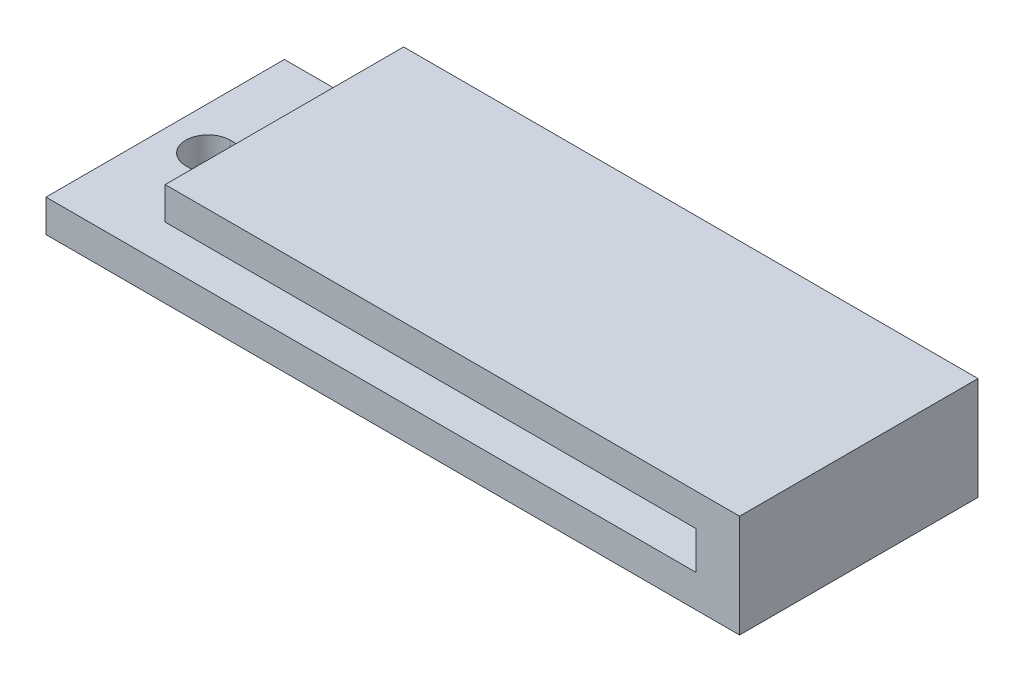
ISO-10303-21;
HEADER;
FILE_DESCRIPTION(('STEP AP214'),'2;1');
FILE_NAME('part.step','',(''),(''),'','','');
FILE_SCHEMA(('AUTOMOTIVE_DESIGN { 1 0 10303 214 1 1 1 1 }'));
ENDSEC;
DATA;
#1=APPLICATION_CONTEXT('core data for automotive mechanical design processes');
#2=APPLICATION_PROTOCOL_DEFINITION('international standard','automotive_design',2000,#1);
#3=PRODUCT_CONTEXT('',#1,'mechanical');
#4=PRODUCT('Part','Part','',(#3));
#5=PRODUCT_RELATED_PRODUCT_CATEGORY('part','',(#4));
#6=PRODUCT_DEFINITION_FORMATION('','',#4);
#7=PRODUCT_DEFINITION_CONTEXT('part definition',#1,'design');
#8=PRODUCT_DEFINITION('design','',#6,#7);
#9=PRODUCT_DEFINITION_SHAPE('','',#8);
#10=(LENGTH_UNIT() NAMED_UNIT(*) SI_UNIT(.MILLI.,.METRE.));
#11=(NAMED_UNIT(*) PLANE_ANGLE_UNIT() SI_UNIT($,.RADIAN.));
#12=(NAMED_UNIT(*) SI_UNIT($,.STERADIAN.) SOLID_ANGLE_UNIT());
#13=UNCERTAINTY_MEASURE_WITH_UNIT(LENGTH_MEASURE(1.E-05),#10,'distance_accuracy_value','');
#14=(GEOMETRIC_REPRESENTATION_CONTEXT(3) GLOBAL_UNCERTAINTY_ASSIGNED_CONTEXT((#13)) GLOBAL_UNIT_ASSIGNED_CONTEXT((#10,
#11,#12)) REPRESENTATION_CONTEXT('',''));
#15=CARTESIAN_POINT('',(0.,0.,0.));
#16=DIRECTION('',(0.,0.,1.));
#17=DIRECTION('',(1.,0.,0.));
#18=AXIS2_PLACEMENT_3D('',#15,#16,#17);
#19=CARTESIAN_POINT('',(-49.,3.,0.));
#20=DIRECTION('',(0.,0.,-1.));
#21=DIRECTION('',(-1.,0.,0.));
#22=AXIS2_PLACEMENT_3D('',#19,#20,#21);
#23=PLANE('',#22);
#24=DIRECTION('',(1.,0.,0.));
#25=VECTOR('',#24,1.);
#26=CARTESIAN_POINT('',(-49.,0.,0.));
#27=LINE('',#26,#25);
#28=CARTESIAN_POINT('',(-49.,0.,0.));
#29=VERTEX_POINT('',#28);
#30=CARTESIAN_POINT('',(0.,0.,0.));
#31=VERTEX_POINT('',#30);
#32=EDGE_CURVE('E236',#29,#31,#27,.T.);
#33=ORIENTED_EDGE('',*,*,#32,.T.);
#34=DIRECTION('',(0.,-1.,0.));
#35=VECTOR('',#34,1.);
#36=CARTESIAN_POINT('',(0.,0.,0.));
#37=LINE('',#36,#35);
#38=CARTESIAN_POINT('',(0.,-3.5,0.));
#39=VERTEX_POINT('',#38);
#40=EDGE_CURVE('E215',#31,#39,#37,.T.);
#41=ORIENTED_EDGE('',*,*,#40,.T.);
#42=DIRECTION('',(-1.,0.,0.));
#43=VECTOR('',#42,1.);
#44=CARTESIAN_POINT('',(0.,-3.5,0.));
#45=LINE('',#44,#43);
#46=CARTESIAN_POINT('',(-60.,-3.5,0.));
#47=VERTEX_POINT('',#46);
#48=EDGE_CURVE('E177',#39,#47,#45,.T.);
#49=ORIENTED_EDGE('',*,*,#48,.T.);
#50=DIRECTION('',(0.,1.,0.));
#51=VECTOR('',#50,1.);
#52=CARTESIAN_POINT('',(-60.,-6.5,0.));
#53=LINE('',#52,#51);
#54=CARTESIAN_POINT('',(-60.,-6.5,0.));
#55=VERTEX_POINT('',#54);
#56=EDGE_CURVE('E211',#55,#47,#53,.T.);
#57=ORIENTED_EDGE('',*,*,#56,.F.);
#58=DIRECTION('',(-1.,0.,0.));
#59=VECTOR('',#58,1.);
#60=CARTESIAN_POINT('',(0.,-6.5,0.));
#61=LINE('',#60,#59);
#62=CARTESIAN_POINT('',(4.,-6.5,0.));
#63=VERTEX_POINT('',#62);
#64=EDGE_CURVE('E183',#63,#55,#61,.T.);
#65=ORIENTED_EDGE('',*,*,#64,.F.);
#66=DIRECTION('',(0.,1.,0.));
#67=VECTOR('',#66,1.);
#68=CARTESIAN_POINT('',(4.,3.,0.));
#69=LINE('',#68,#67);
#70=CARTESIAN_POINT('',(4.,3.,0.));
#71=VERTEX_POINT('',#70);
#72=EDGE_CURVE('E221',#63,#71,#69,.T.);
#73=ORIENTED_EDGE('',*,*,#72,.T.);
#74=DIRECTION('',(1.,0.,0.));
#75=VECTOR('',#74,1.);
#76=CARTESIAN_POINT('',(-49.,3.,0.));
#77=LINE('',#76,#75);
#78=CARTESIAN_POINT('',(-49.,3.,0.));
#79=VERTEX_POINT('',#78);
#80=EDGE_CURVE('E240',#79,#71,#77,.T.);
#81=ORIENTED_EDGE('',*,*,#80,.F.);
#82=DIRECTION('',(0.,-1.,0.));
#83=VECTOR('',#82,1.);
#84=CARTESIAN_POINT('',(-49.,3.,0.));
#85=LINE('',#84,#83);
#86=EDGE_CURVE('E53',#79,#29,#85,.T.);
#87=ORIENTED_EDGE('',*,*,#86,.T.);
#88=EDGE_LOOP('',(#33,#41,#49,#57,#65,#73,#81,#87));
#89=FACE_BOUND('',#88,.T.);
#90=ADVANCED_FACE('F45',(#89),#23,.F.);
#91=CARTESIAN_POINT('',(0.,3.,-22.));
#92=DIRECTION('',(0.,0.,1.));
#93=DIRECTION('',(1.,0.,0.));
#94=AXIS2_PLACEMENT_3D('',#91,#92,#93);
#95=PLANE('',#94);
#96=DIRECTION('',(-1.,0.,0.));
#97=VECTOR('',#96,1.);
#98=CARTESIAN_POINT('',(0.,0.,-22.));
#99=LINE('',#98,#97);
#100=CARTESIAN_POINT('',(0.,0.,-22.));
#101=VERTEX_POINT('',#100);
#102=CARTESIAN_POINT('',(-49.,0.,-22.));
#103=VERTEX_POINT('',#102);
#104=EDGE_CURVE('E257',#101,#103,#99,.T.);
#105=ORIENTED_EDGE('',*,*,#104,.T.);
#106=DIRECTION('',(0.,-1.,0.));
#107=VECTOR('',#106,1.);
#108=CARTESIAN_POINT('',(-49.,3.,-22.));
#109=LINE('',#108,#107);
#110=CARTESIAN_POINT('',(-49.,3.,-22.));
#111=VERTEX_POINT('',#110);
#112=EDGE_CURVE('E11',#111,#103,#109,.T.);
#113=ORIENTED_EDGE('',*,*,#112,.F.);
#114=DIRECTION('',(-1.,0.,0.));
#115=VECTOR('',#114,1.);
#116=CARTESIAN_POINT('',(0.,3.,-22.));
#117=LINE('',#116,#115);
#118=CARTESIAN_POINT('',(4.,3.,-22.));
#119=VERTEX_POINT('',#118);
#120=EDGE_CURVE('E243',#119,#111,#117,.T.);
#121=ORIENTED_EDGE('',*,*,#120,.F.);
#122=DIRECTION('',(0.,1.,0.));
#123=VECTOR('',#122,1.);
#124=CARTESIAN_POINT('',(4.,3.,-22.));
#125=LINE('',#124,#123);
#126=CARTESIAN_POINT('',(4.,-6.5,-22.));
#127=VERTEX_POINT('',#126);
#128=EDGE_CURVE('E220',#127,#119,#125,.T.);
#129=ORIENTED_EDGE('',*,*,#128,.F.);
#130=DIRECTION('',(1.,0.,0.));
#131=VECTOR('',#130,1.);
#132=CARTESIAN_POINT('',(0.,-6.5,-22.));
#133=LINE('',#132,#131);
#134=CARTESIAN_POINT('',(-60.,-6.5,-22.));
#135=VERTEX_POINT('',#134);
#136=EDGE_CURVE('E190',#135,#127,#133,.T.);
#137=ORIENTED_EDGE('',*,*,#136,.F.);
#138=DIRECTION('',(0.,1.,0.));
#139=VECTOR('',#138,1.);
#140=CARTESIAN_POINT('',(-60.,-6.5,-22.));
#141=LINE('',#140,#139);
#142=CARTESIAN_POINT('',(-60.,-3.5,-22.));
#143=VERTEX_POINT('',#142);
#144=EDGE_CURVE('E198',#135,#143,#141,.T.);
#145=ORIENTED_EDGE('',*,*,#144,.T.);
#146=DIRECTION('',(1.,0.,0.));
#147=VECTOR('',#146,1.);
#148=CARTESIAN_POINT('',(4.,-3.5,-22.));
#149=LINE('',#148,#147);
#150=CARTESIAN_POINT('',(0.,-3.5,-22.));
#151=VERTEX_POINT('',#150);
#152=EDGE_CURVE('E187',#143,#151,#149,.T.);
#153=ORIENTED_EDGE('',*,*,#152,.T.);
#154=DIRECTION('',(0.,-1.,0.));
#155=VECTOR('',#154,1.);
#156=CARTESIAN_POINT('',(0.,0.,-22.));
#157=LINE('',#156,#155);
#158=EDGE_CURVE('E216',#101,#151,#157,.T.);
#159=ORIENTED_EDGE('',*,*,#158,.F.);
#160=EDGE_LOOP('',(#105,#113,#121,#129,#137,#145,#153,#159));
#161=FACE_BOUND('',#160,.T.);
#162=ADVANCED_FACE('F277',(#161),#95,.F.);
#163=CARTESIAN_POINT('',(-49.,3.,-22.));
#164=DIRECTION('',(1.,0.,0.));
#165=DIRECTION('',(0.,0.,-1.));
#166=AXIS2_PLACEMENT_3D('',#163,#164,#165);
#167=PLANE('',#166);
#168=DIRECTION('',(0.,0.,1.));
#169=VECTOR('',#168,1.);
#170=CARTESIAN_POINT('',(-49.,0.,-22.));
#171=LINE('',#170,#169);
#172=EDGE_CURVE('E244',#103,#29,#171,.T.);
#173=ORIENTED_EDGE('',*,*,#172,.T.);
#174=ORIENTED_EDGE('',*,*,#86,.F.);
#175=DIRECTION('',(0.,0.,1.));
#176=VECTOR('',#175,1.);
#177=CARTESIAN_POINT('',(-49.,3.,-22.));
#178=LINE('',#177,#176);
#179=EDGE_CURVE('E247',#111,#79,#178,.T.);
#180=ORIENTED_EDGE('',*,*,#179,.F.);
#181=ORIENTED_EDGE('',*,*,#112,.T.);
#182=EDGE_LOOP('',(#173,#174,#180,#181));
#183=FACE_BOUND('',#182,.T.);
#184=ADVANCED_FACE('F295',(#183),#167,.F.);
#185=CARTESIAN_POINT('',(0.,3.,0.));
#186=DIRECTION('',(0.,1.,0.));
#187=DIRECTION('',(0.,0.,1.));
#188=AXIS2_PLACEMENT_3D('',#185,#186,#187);
#189=PLANE('',#188);
#190=ORIENTED_EDGE('',*,*,#80,.T.);
#191=DIRECTION('',(0.,0.,1.));
#192=VECTOR('',#191,1.);
#193=CARTESIAN_POINT('',(4.,3.,-22.));
#194=LINE('',#193,#192);
#195=EDGE_CURVE('E232',#119,#71,#194,.T.);
#196=ORIENTED_EDGE('',*,*,#195,.F.);
#197=ORIENTED_EDGE('',*,*,#120,.T.);
#198=ORIENTED_EDGE('',*,*,#179,.T.);
#199=EDGE_LOOP('',(#190,#196,#197,#198));
#200=FACE_BOUND('',#199,.T.);
#201=ADVANCED_FACE('F294',(#200),#189,.T.);
#202=CARTESIAN_POINT('',(0.,0.,0.));
#203=DIRECTION('',(0.,1.,0.));
#204=DIRECTION('',(0.,0.,1.));
#205=AXIS2_PLACEMENT_3D('',#202,#203,#204);
#206=PLANE('',#205);
#207=ORIENTED_EDGE('',*,*,#32,.F.);
#208=ORIENTED_EDGE('',*,*,#172,.F.);
#209=ORIENTED_EDGE('',*,*,#104,.F.);
#210=DIRECTION('',(0.,0.,-1.));
#211=VECTOR('',#210,1.);
#212=CARTESIAN_POINT('',(0.,0.,0.));
#213=LINE('',#212,#211);
#214=EDGE_CURVE('E253',#31,#101,#213,.T.);
#215=ORIENTED_EDGE('',*,*,#214,.F.);
#216=EDGE_LOOP('',(#207,#208,#209,#215));
#217=FACE_BOUND('',#216,.T.);
#218=ADVANCED_FACE('F272',(#217),#206,.F.);
#219=CARTESIAN_POINT('',(4.,3.,-22.));
#220=DIRECTION('',(1.,0.,0.));
#221=DIRECTION('',(0.,1.,0.));
#222=AXIS2_PLACEMENT_3D('',#219,#220,#221);
#223=PLANE('',#222);
#224=ORIENTED_EDGE('',*,*,#72,.F.);
#225=DIRECTION('',(0.,0.,1.));
#226=VECTOR('',#225,1.);
#227=CARTESIAN_POINT('',(4.,-6.5,0.));
#228=LINE('',#227,#226);
#229=EDGE_CURVE('E194',#127,#63,#228,.T.);
#230=ORIENTED_EDGE('',*,*,#229,.F.);
#231=ORIENTED_EDGE('',*,*,#128,.T.);
#232=ORIENTED_EDGE('',*,*,#195,.T.);
#233=EDGE_LOOP('',(#224,#230,#231,#232));
#234=FACE_BOUND('',#233,.T.);
#235=ADVANCED_FACE('F291',(#234),#223,.T.);
#236=CARTESIAN_POINT('',(0.,0.,-22.));
#237=DIRECTION('',(-1.,0.,0.));
#238=DIRECTION('',(0.,-1.,0.));
#239=AXIS2_PLACEMENT_3D('',#236,#237,#238);
#240=PLANE('',#239);
#241=ORIENTED_EDGE('',*,*,#40,.F.);
#242=ORIENTED_EDGE('',*,*,#214,.T.);
#243=ORIENTED_EDGE('',*,*,#158,.T.);
#244=DIRECTION('',(0.,0.,1.));
#245=VECTOR('',#244,1.);
#246=CARTESIAN_POINT('',(0.,-3.5,-22.));
#247=LINE('',#246,#245);
#248=EDGE_CURVE('E225',#151,#39,#247,.T.);
#249=ORIENTED_EDGE('',*,*,#248,.T.);
#250=EDGE_LOOP('',(#241,#242,#243,#249));
#251=FACE_BOUND('',#250,.T.);
#252=ADVANCED_FACE('F275',(#251),#240,.T.);
#253=CARTESIAN_POINT('',(0.,-3.5,0.));
#254=DIRECTION('',(0.,1.,0.));
#255=DIRECTION('',(0.,0.,1.));
#256=AXIS2_PLACEMENT_3D('',#253,#254,#255);
#257=PLANE('',#256);
#258=CARTESIAN_POINT('',(-56.05,-3.5,-11.));
#259=DIRECTION('',(0.,-1.,0.));
#260=DIRECTION('',(0.,0.,-1.));
#261=AXIS2_PLACEMENT_3D('',#258,#259,#260);
#262=CIRCLE('',#261,2.04999999999999);
#263=CARTESIAN_POINT('',(-56.05,-3.5,-8.95000000000001));
#264=VERTEX_POINT('',#263);
#265=CARTESIAN_POINT('',(-56.05,-3.5,-13.05));
#266=VERTEX_POINT('',#265);
#267=EDGE_CURVE('E136',#264,#266,#262,.T.);
#268=ORIENTED_EDGE('',*,*,#267,.T.);
#269=DIRECTION('',(1.,0.,0.));
#270=VECTOR('',#269,1.);
#271=CARTESIAN_POINT('',(-56.05,-3.5,-13.05));
#272=LINE('',#271,#270);
#273=CARTESIAN_POINT('',(-54.,-3.5,-13.05));
#274=VERTEX_POINT('',#273);
#275=EDGE_CURVE('E146',#266,#274,#272,.T.);
#276=ORIENTED_EDGE('',*,*,#275,.T.);
#277=CARTESIAN_POINT('',(-54.,-3.5,-11.));
#278=DIRECTION('',(0.,-1.,0.));
#279=DIRECTION('',(0.,0.,1.));
#280=AXIS2_PLACEMENT_3D('',#277,#278,#279);
#281=CIRCLE('',#280,2.05);
#282=CARTESIAN_POINT('',(-54.,-3.5,-8.95000000000001));
#283=VERTEX_POINT('',#282);
#284=EDGE_CURVE('E60',#274,#283,#281,.T.);
#285=ORIENTED_EDGE('',*,*,#284,.T.);
#286=DIRECTION('',(-1.,0.,0.));
#287=VECTOR('',#286,1.);
#288=CARTESIAN_POINT('',(-56.05,-3.5,-8.95000000000001));
#289=LINE('',#288,#287);
#290=EDGE_CURVE('E143',#283,#264,#289,.T.);
#291=ORIENTED_EDGE('',*,*,#290,.T.);
#292=EDGE_LOOP('',(#268,#276,#285,#291));
#293=FACE_BOUND('',#292,.T.);
#294=ORIENTED_EDGE('',*,*,#248,.F.);
#295=ORIENTED_EDGE('',*,*,#152,.F.);
#296=DIRECTION('',(0.,0.,-1.));
#297=VECTOR('',#296,1.);
#298=CARTESIAN_POINT('',(-60.,-3.5,-22.));
#299=LINE('',#298,#297);
#300=EDGE_CURVE('E201',#47,#143,#299,.T.);
#301=ORIENTED_EDGE('',*,*,#300,.F.);
#302=ORIENTED_EDGE('',*,*,#48,.F.);
#303=EDGE_LOOP('',(#294,#295,#301,#302));
#304=FACE_BOUND('',#303,.T.);
#305=ADVANCED_FACE('F151',(#293,#304),#257,.T.);
#306=CARTESIAN_POINT('',(-60.,-6.5,-22.));
#307=DIRECTION('',(1.,0.,0.));
#308=DIRECTION('',(0.,0.,-1.));
#309=AXIS2_PLACEMENT_3D('',#306,#307,#308);
#310=PLANE('',#309);
#311=ORIENTED_EDGE('',*,*,#300,.T.);
#312=ORIENTED_EDGE('',*,*,#144,.F.);
#313=DIRECTION('',(0.,0.,-1.));
#314=VECTOR('',#313,1.);
#315=CARTESIAN_POINT('',(-60.,-6.5,-22.));
#316=LINE('',#315,#314);
#317=EDGE_CURVE('E186',#55,#135,#316,.T.);
#318=ORIENTED_EDGE('',*,*,#317,.F.);
#319=ORIENTED_EDGE('',*,*,#56,.T.);
#320=EDGE_LOOP('',(#311,#312,#318,#319));
#321=FACE_BOUND('',#320,.T.);
#322=ADVANCED_FACE('F283',(#321),#310,.F.);
#323=CARTESIAN_POINT('',(0.,-6.5,0.));
#324=DIRECTION('',(0.,1.,0.));
#325=DIRECTION('',(0.,0.,1.));
#326=AXIS2_PLACEMENT_3D('',#323,#324,#325);
#327=PLANE('',#326);
#328=DIRECTION('',(1.,0.,0.));
#329=VECTOR('',#328,1.);
#330=CARTESIAN_POINT('',(-56.05,-6.5,-13.05));
#331=LINE('',#330,#329);
#332=CARTESIAN_POINT('',(-56.05,-6.5,-13.05));
#333=VERTEX_POINT('',#332);
#334=CARTESIAN_POINT('',(-54.,-6.5,-13.05));
#335=VERTEX_POINT('',#334);
#336=EDGE_CURVE('E168',#333,#335,#331,.T.);
#337=ORIENTED_EDGE('',*,*,#336,.F.);
#338=CARTESIAN_POINT('',(-56.05,-6.5,-11.));
#339=DIRECTION('',(0.,-1.,0.));
#340=DIRECTION('',(0.,0.,-1.));
#341=AXIS2_PLACEMENT_3D('',#338,#339,#340);
#342=CIRCLE('',#341,2.04999999999999);
#343=CARTESIAN_POINT('',(-56.05,-6.5,-8.95000000000001));
#344=VERTEX_POINT('',#343);
#345=EDGE_CURVE('E68',#344,#333,#342,.T.);
#346=ORIENTED_EDGE('',*,*,#345,.F.);
#347=DIRECTION('',(-1.,0.,0.));
#348=VECTOR('',#347,1.);
#349=CARTESIAN_POINT('',(-56.05,-6.5,-8.95000000000001));
#350=LINE('',#349,#348);
#351=CARTESIAN_POINT('',(-54.,-6.5,-8.95000000000001));
#352=VERTEX_POINT('',#351);
#353=EDGE_CURVE('E155',#352,#344,#350,.T.);
#354=ORIENTED_EDGE('',*,*,#353,.F.);
#355=CARTESIAN_POINT('',(-54.,-6.5,-11.));
#356=DIRECTION('',(0.,-1.,0.));
#357=DIRECTION('',(0.,0.,1.));
#358=AXIS2_PLACEMENT_3D('',#355,#356,#357);
#359=CIRCLE('',#358,2.05);
#360=EDGE_CURVE('E159',#335,#352,#359,.T.);
#361=ORIENTED_EDGE('',*,*,#360,.F.);
#362=EDGE_LOOP('',(#337,#346,#354,#361));
#363=FACE_BOUND('',#362,.T.);
#364=ORIENTED_EDGE('',*,*,#64,.T.);
#365=ORIENTED_EDGE('',*,*,#317,.T.);
#366=ORIENTED_EDGE('',*,*,#136,.T.);
#367=ORIENTED_EDGE('',*,*,#229,.T.);
#368=EDGE_LOOP('',(#364,#365,#366,#367));
#369=FACE_BOUND('',#368,.T.);
#370=ADVANCED_FACE('F288',(#363,#369),#327,.F.);
#371=CARTESIAN_POINT('',(-56.05,-3.5,-11.));
#372=DIRECTION('',(0.,-1.,0.));
#373=DIRECTION('',(0.,0.,-1.));
#374=AXIS2_PLACEMENT_3D('',#371,#372,#373);
#375=CYLINDRICAL_SURFACE('',#374,2.04999999999999);
#376=ORIENTED_EDGE('',*,*,#345,.T.);
#377=DIRECTION('',(0.,-1.,0.));
#378=VECTOR('',#377,1.);
#379=CARTESIAN_POINT('',(-56.05,-3.5,-13.05));
#380=LINE('',#379,#378);
#381=EDGE_CURVE('E132',#266,#333,#380,.T.);
#382=ORIENTED_EDGE('',*,*,#381,.F.);
#383=ORIENTED_EDGE('',*,*,#267,.F.);
#384=DIRECTION('',(0.,-1.,0.));
#385=VECTOR('',#384,1.);
#386=CARTESIAN_POINT('',(-56.05,-3.5,-8.95000000000001));
#387=LINE('',#386,#385);
#388=EDGE_CURVE('E174',#264,#344,#387,.T.);
#389=ORIENTED_EDGE('',*,*,#388,.T.);
#390=EDGE_LOOP('',(#376,#382,#383,#389));
#391=FACE_BOUND('',#390,.T.);
#392=ADVANCED_FACE('F134',(#391),#375,.F.);
#393=CARTESIAN_POINT('',(-56.05,-3.5,-8.95000000000001));
#394=DIRECTION('',(0.,0.,1.));
#395=DIRECTION('',(1.,0.,0.));
#396=AXIS2_PLACEMENT_3D('',#393,#394,#395);
#397=PLANE('',#396);
#398=ORIENTED_EDGE('',*,*,#353,.T.);
#399=ORIENTED_EDGE('',*,*,#388,.F.);
#400=ORIENTED_EDGE('',*,*,#290,.F.);
#401=DIRECTION('',(0.,-1.,0.));
#402=VECTOR('',#401,1.);
#403=CARTESIAN_POINT('',(-54.,-3.5,-8.95000000000001));
#404=LINE('',#403,#402);
#405=EDGE_CURVE('E178',#283,#352,#404,.T.);
#406=ORIENTED_EDGE('',*,*,#405,.T.);
#407=EDGE_LOOP('',(#398,#399,#400,#406));
#408=FACE_BOUND('',#407,.T.);
#409=ADVANCED_FACE('F358',(#408),#397,.F.);
#410=CARTESIAN_POINT('',(-54.,-3.5,-11.));
#411=DIRECTION('',(0.,-1.,0.));
#412=DIRECTION('',(0.,0.,-1.));
#413=AXIS2_PLACEMENT_3D('',#410,#411,#412);
#414=CYLINDRICAL_SURFACE('',#413,2.05);
#415=ORIENTED_EDGE('',*,*,#360,.T.);
#416=ORIENTED_EDGE('',*,*,#405,.F.);
#417=ORIENTED_EDGE('',*,*,#284,.F.);
#418=DIRECTION('',(0.,-1.,0.));
#419=VECTOR('',#418,1.);
#420=CARTESIAN_POINT('',(-54.,-3.5,-13.05));
#421=LINE('',#420,#419);
#422=EDGE_CURVE('E142',#274,#335,#421,.T.);
#423=ORIENTED_EDGE('',*,*,#422,.T.);
#424=EDGE_LOOP('',(#415,#416,#417,#423));
#425=FACE_BOUND('',#424,.T.);
#426=ADVANCED_FACE('F366',(#425),#414,.F.);
#427=CARTESIAN_POINT('',(-56.05,-3.5,-13.05));
#428=DIRECTION('',(0.,0.,-1.));
#429=DIRECTION('',(-1.,0.,0.));
#430=AXIS2_PLACEMENT_3D('',#427,#428,#429);
#431=PLANE('',#430);
#432=ORIENTED_EDGE('',*,*,#336,.T.);
#433=ORIENTED_EDGE('',*,*,#422,.F.);
#434=ORIENTED_EDGE('',*,*,#275,.F.);
#435=ORIENTED_EDGE('',*,*,#381,.T.);
#436=EDGE_LOOP('',(#432,#433,#434,#435));
#437=FACE_BOUND('',#436,.T.);
#438=ADVANCED_FACE('F147',(#437),#431,.F.);
#439=CLOSED_SHELL('',(#90,#162,#184,#201,#218,#235,#252,#305,#322,#370,#392,#409,#426,#438));
#440=MANIFOLD_SOLID_BREP('B2',#439);
#441=ADVANCED_BREP_SHAPE_REPRESENTATION('',(#18,#440),#14);
#442=SHAPE_DEFINITION_REPRESENTATION(#9,#441);
ENDSEC;
END-ISO-10303-21;
